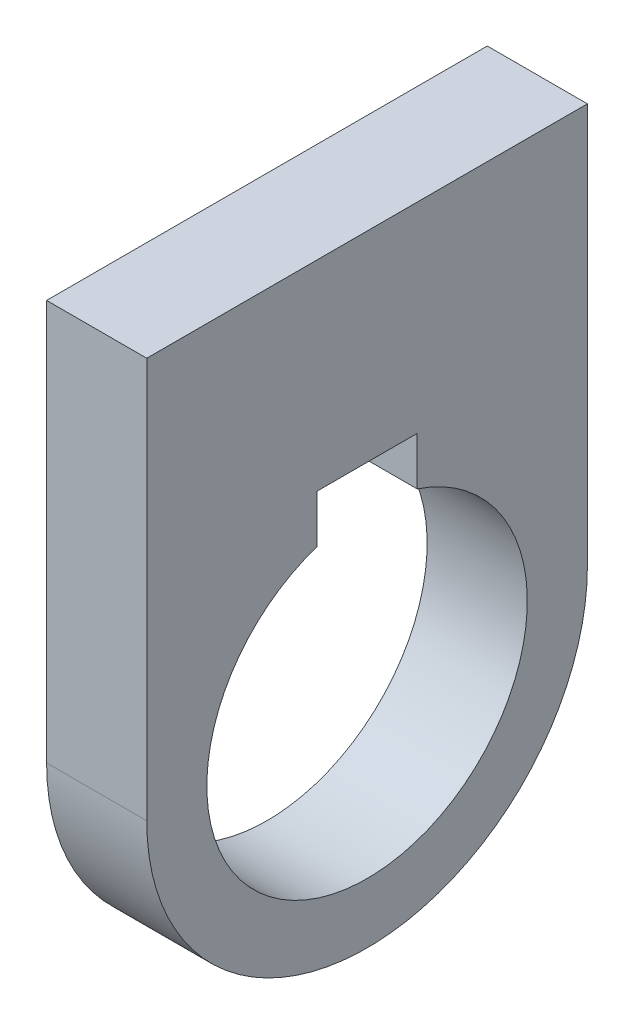
ISO-10303-21;
HEADER;
FILE_DESCRIPTION(('STEP AP214'),'2;1');
FILE_NAME('part.step','',(''),(''),'','','');
FILE_SCHEMA(('AUTOMOTIVE_DESIGN { 1 0 10303 214 1 1 1 1 }'));
ENDSEC;
DATA;
#1=APPLICATION_CONTEXT('core data for automotive mechanical design processes');
#2=APPLICATION_PROTOCOL_DEFINITION('international standard','automotive_design',2000,#1);
#3=PRODUCT_CONTEXT('',#1,'mechanical');
#4=PRODUCT('Part','Part','',(#3));
#5=PRODUCT_RELATED_PRODUCT_CATEGORY('part','',(#4));
#6=PRODUCT_DEFINITION_FORMATION('','',#4);
#7=PRODUCT_DEFINITION_CONTEXT('part definition',#1,'design');
#8=PRODUCT_DEFINITION('design','',#6,#7);
#9=PRODUCT_DEFINITION_SHAPE('','',#8);
#10=(LENGTH_UNIT() NAMED_UNIT(*) SI_UNIT(.MILLI.,.METRE.));
#11=(NAMED_UNIT(*) PLANE_ANGLE_UNIT() SI_UNIT($,.RADIAN.));
#12=(NAMED_UNIT(*) SI_UNIT($,.STERADIAN.) SOLID_ANGLE_UNIT());
#13=UNCERTAINTY_MEASURE_WITH_UNIT(LENGTH_MEASURE(1.E-05),#10,'distance_accuracy_value','');
#14=(GEOMETRIC_REPRESENTATION_CONTEXT(3) GLOBAL_UNCERTAINTY_ASSIGNED_CONTEXT((#13)) GLOBAL_UNIT_ASSIGNED_CONTEXT((#10,
#11,#12)) REPRESENTATION_CONTEXT('',''));
#15=CARTESIAN_POINT('',(0.,0.,0.));
#16=DIRECTION('',(0.,0.,1.));
#17=DIRECTION('',(1.,0.,0.));
#18=AXIS2_PLACEMENT_3D('',#15,#16,#17);
#19=CARTESIAN_POINT('',(5.,0.,0.));
#20=DIRECTION('',(1.,0.,0.));
#21=DIRECTION('',(0.,0.,-1.));
#22=AXIS2_PLACEMENT_3D('',#19,#20,#21);
#23=PLANE('',#22);
#24=CARTESIAN_POINT('',(5.,0.,0.));
#25=DIRECTION('',(1.,0.,0.));
#26=DIRECTION('',(0.,0.,-1.));
#27=AXIS2_PLACEMENT_3D('',#24,#25,#26);
#28=CIRCLE('',#27,11.);
#29=CARTESIAN_POINT('',(5.,0.,11.));
#30=VERTEX_POINT('',#29);
#31=CARTESIAN_POINT('',(5.,0.,-11.));
#32=VERTEX_POINT('',#31);
#33=EDGE_CURVE('E138',#30,#32,#28,.T.);
#34=ORIENTED_EDGE('',*,*,#33,.T.);
#35=DIRECTION('',(0.,1.,0.));
#36=VECTOR('',#35,1.);
#37=CARTESIAN_POINT('',(5.,20.,-11.));
#38=LINE('',#37,#36);
#39=CARTESIAN_POINT('',(5.,20.,-11.));
#40=VERTEX_POINT('',#39);
#41=EDGE_CURVE('E141',#32,#40,#38,.T.);
#42=ORIENTED_EDGE('',*,*,#41,.T.);
#43=DIRECTION('',(0.,0.,1.));
#44=VECTOR('',#43,1.);
#45=CARTESIAN_POINT('',(5.,20.,11.));
#46=LINE('',#45,#44);
#47=CARTESIAN_POINT('',(5.,20.,11.));
#48=VERTEX_POINT('',#47);
#49=EDGE_CURVE('E144',#40,#48,#46,.T.);
#50=ORIENTED_EDGE('',*,*,#49,.T.);
#51=DIRECTION('',(0.,-1.,0.));
#52=VECTOR('',#51,1.);
#53=CARTESIAN_POINT('',(5.,0.,11.));
#54=LINE('',#53,#52);
#55=EDGE_CURVE('E146',#48,#30,#54,.T.);
#56=ORIENTED_EDGE('',*,*,#55,.T.);
#57=EDGE_LOOP('',(#34,#42,#50,#56));
#58=FACE_BOUND('',#57,.T.);
#59=CARTESIAN_POINT('',(5.,0.,0.));
#60=DIRECTION('',(1.,0.,0.));
#61=DIRECTION('',(0.,0.,-1.));
#62=AXIS2_PLACEMENT_3D('',#59,#60,#61);
#63=CIRCLE('',#62,8.);
#64=CARTESIAN_POINT('',(5.,7.59934207678533,2.5));
#65=VERTEX_POINT('',#64);
#66=CARTESIAN_POINT('',(5.,7.59934207678533,-2.5));
#67=VERTEX_POINT('',#66);
#68=EDGE_CURVE('E110',#65,#67,#63,.T.);
#69=ORIENTED_EDGE('',*,*,#68,.F.);
#70=DIRECTION('',(0.,-1.,0.));
#71=VECTOR('',#70,1.);
#72=CARTESIAN_POINT('',(5.,10.,2.5));
#73=LINE('',#72,#71);
#74=CARTESIAN_POINT('',(5.,10.,2.5));
#75=VERTEX_POINT('',#74);
#76=EDGE_CURVE('E102',#75,#65,#73,.T.);
#77=ORIENTED_EDGE('',*,*,#76,.F.);
#78=DIRECTION('',(0.,0.,1.));
#79=VECTOR('',#78,1.);
#80=CARTESIAN_POINT('',(5.,10.,2.5));
#81=LINE('',#80,#79);
#82=CARTESIAN_POINT('',(5.,10.,-2.5));
#83=VERTEX_POINT('',#82);
#84=EDGE_CURVE('E124',#83,#75,#81,.T.);
#85=ORIENTED_EDGE('',*,*,#84,.F.);
#86=DIRECTION('',(0.,1.,0.));
#87=VECTOR('',#86,1.);
#88=CARTESIAN_POINT('',(5.,10.,-2.5));
#89=LINE('',#88,#87);
#90=EDGE_CURVE('E122',#67,#83,#89,.T.);
#91=ORIENTED_EDGE('',*,*,#90,.F.);
#92=EDGE_LOOP('',(#69,#77,#85,#91));
#93=FACE_BOUND('',#92,.T.);
#94=ADVANCED_FACE('F37',(#58,#93),#23,.T.);
#95=CARTESIAN_POINT('',(0.,0.,0.));
#96=DIRECTION('',(1.,0.,0.));
#97=DIRECTION('',(0.,0.,-1.));
#98=AXIS2_PLACEMENT_3D('',#95,#96,#97);
#99=PLANE('',#98);
#100=CARTESIAN_POINT('',(0.,0.,0.));
#101=DIRECTION('',(1.,0.,0.));
#102=DIRECTION('',(0.,0.,-1.));
#103=AXIS2_PLACEMENT_3D('',#100,#101,#102);
#104=CIRCLE('',#103,11.);
#105=CARTESIAN_POINT('',(0.,0.,11.));
#106=VERTEX_POINT('',#105);
#107=CARTESIAN_POINT('',(0.,0.,-11.));
#108=VERTEX_POINT('',#107);
#109=EDGE_CURVE('E118',#106,#108,#104,.T.);
#110=ORIENTED_EDGE('',*,*,#109,.F.);
#111=DIRECTION('',(0.,-1.,0.));
#112=VECTOR('',#111,1.);
#113=CARTESIAN_POINT('',(0.,0.,11.));
#114=LINE('',#113,#112);
#115=CARTESIAN_POINT('',(0.,20.,11.));
#116=VERTEX_POINT('',#115);
#117=EDGE_CURVE('E142',#116,#106,#114,.T.);
#118=ORIENTED_EDGE('',*,*,#117,.F.);
#119=DIRECTION('',(0.,0.,1.));
#120=VECTOR('',#119,1.);
#121=CARTESIAN_POINT('',(0.,20.,11.));
#122=LINE('',#121,#120);
#123=CARTESIAN_POINT('',(0.,20.,-11.));
#124=VERTEX_POINT('',#123);
#125=EDGE_CURVE('E153',#124,#116,#122,.T.);
#126=ORIENTED_EDGE('',*,*,#125,.F.);
#127=DIRECTION('',(0.,1.,0.));
#128=VECTOR('',#127,1.);
#129=CARTESIAN_POINT('',(0.,20.,-11.));
#130=LINE('',#129,#128);
#131=EDGE_CURVE('E151',#108,#124,#130,.T.);
#132=ORIENTED_EDGE('',*,*,#131,.F.);
#133=EDGE_LOOP('',(#110,#118,#126,#132));
#134=FACE_BOUND('',#133,.T.);
#135=DIRECTION('',(0.,-1.,0.));
#136=VECTOR('',#135,1.);
#137=CARTESIAN_POINT('',(0.,10.,2.5));
#138=LINE('',#137,#136);
#139=CARTESIAN_POINT('',(0.,10.,2.5));
#140=VERTEX_POINT('',#139);
#141=CARTESIAN_POINT('',(0.,7.59934207678533,2.5));
#142=VERTEX_POINT('',#141);
#143=EDGE_CURVE('E60',#140,#142,#138,.T.);
#144=ORIENTED_EDGE('',*,*,#143,.T.);
#145=CARTESIAN_POINT('',(0.,0.,0.));
#146=DIRECTION('',(1.,0.,0.));
#147=DIRECTION('',(0.,0.,-1.));
#148=AXIS2_PLACEMENT_3D('',#145,#146,#147);
#149=CIRCLE('',#148,8.);
#150=CARTESIAN_POINT('',(0.,7.59934207678533,-2.5));
#151=VERTEX_POINT('',#150);
#152=EDGE_CURVE('E117',#142,#151,#149,.T.);
#153=ORIENTED_EDGE('',*,*,#152,.T.);
#154=DIRECTION('',(0.,1.,0.));
#155=VECTOR('',#154,1.);
#156=CARTESIAN_POINT('',(0.,10.,-2.5));
#157=LINE('',#156,#155);
#158=CARTESIAN_POINT('',(0.,10.,-2.5));
#159=VERTEX_POINT('',#158);
#160=EDGE_CURVE('E130',#151,#159,#157,.T.);
#161=ORIENTED_EDGE('',*,*,#160,.T.);
#162=DIRECTION('',(0.,0.,1.));
#163=VECTOR('',#162,1.);
#164=CARTESIAN_POINT('',(0.,10.,2.5));
#165=LINE('',#164,#163);
#166=EDGE_CURVE('E111',#159,#140,#165,.T.);
#167=ORIENTED_EDGE('',*,*,#166,.T.);
#168=EDGE_LOOP('',(#144,#153,#161,#167));
#169=FACE_BOUND('',#168,.T.);
#170=ADVANCED_FACE('F171',(#134,#169),#99,.F.);
#171=CARTESIAN_POINT('',(5.,0.,0.));
#172=DIRECTION('',(-1.,0.,0.));
#173=DIRECTION('',(0.,0.,1.));
#174=AXIS2_PLACEMENT_3D('',#171,#172,#173);
#175=CYLINDRICAL_SURFACE('',#174,11.);
#176=ORIENTED_EDGE('',*,*,#109,.T.);
#177=DIRECTION('',(-1.,0.,0.));
#178=VECTOR('',#177,1.);
#179=CARTESIAN_POINT('',(5.,0.,-11.));
#180=LINE('',#179,#178);
#181=EDGE_CURVE('E11',#32,#108,#180,.T.);
#182=ORIENTED_EDGE('',*,*,#181,.F.);
#183=ORIENTED_EDGE('',*,*,#33,.F.);
#184=DIRECTION('',(-1.,0.,0.));
#185=VECTOR('',#184,1.);
#186=CARTESIAN_POINT('',(5.,0.,11.));
#187=LINE('',#186,#185);
#188=EDGE_CURVE('E148',#30,#106,#187,.T.);
#189=ORIENTED_EDGE('',*,*,#188,.T.);
#190=EDGE_LOOP('',(#176,#182,#183,#189));
#191=FACE_BOUND('',#190,.T.);
#192=ADVANCED_FACE('F39',(#191),#175,.T.);
#193=CARTESIAN_POINT('',(5.,20.,-11.));
#194=DIRECTION('',(0.,0.,1.));
#195=DIRECTION('',(0.,-1.,0.));
#196=AXIS2_PLACEMENT_3D('',#193,#194,#195);
#197=PLANE('',#196);
#198=ORIENTED_EDGE('',*,*,#131,.T.);
#199=DIRECTION('',(-1.,0.,0.));
#200=VECTOR('',#199,1.);
#201=CARTESIAN_POINT('',(5.,20.,-11.));
#202=LINE('',#201,#200);
#203=EDGE_CURVE('E45',#40,#124,#202,.T.);
#204=ORIENTED_EDGE('',*,*,#203,.F.);
#205=ORIENTED_EDGE('',*,*,#41,.F.);
#206=ORIENTED_EDGE('',*,*,#181,.T.);
#207=EDGE_LOOP('',(#198,#204,#205,#206));
#208=FACE_BOUND('',#207,.T.);
#209=ADVANCED_FACE('F181',(#208),#197,.F.);
#210=CARTESIAN_POINT('',(5.,20.,11.));
#211=DIRECTION('',(0.,-1.,0.));
#212=DIRECTION('',(0.,0.,-1.));
#213=AXIS2_PLACEMENT_3D('',#210,#211,#212);
#214=PLANE('',#213);
#215=ORIENTED_EDGE('',*,*,#125,.T.);
#216=DIRECTION('',(-1.,0.,0.));
#217=VECTOR('',#216,1.);
#218=CARTESIAN_POINT('',(5.,20.,11.));
#219=LINE('',#218,#217);
#220=EDGE_CURVE('E158',#48,#116,#219,.T.);
#221=ORIENTED_EDGE('',*,*,#220,.F.);
#222=ORIENTED_EDGE('',*,*,#49,.F.);
#223=ORIENTED_EDGE('',*,*,#203,.T.);
#224=EDGE_LOOP('',(#215,#221,#222,#223));
#225=FACE_BOUND('',#224,.T.);
#226=ADVANCED_FACE('F165',(#225),#214,.F.);
#227=CARTESIAN_POINT('',(5.,0.,11.));
#228=DIRECTION('',(0.,0.,-1.));
#229=DIRECTION('',(0.,1.,0.));
#230=AXIS2_PLACEMENT_3D('',#227,#228,#229);
#231=PLANE('',#230);
#232=ORIENTED_EDGE('',*,*,#117,.T.);
#233=ORIENTED_EDGE('',*,*,#188,.F.);
#234=ORIENTED_EDGE('',*,*,#55,.F.);
#235=ORIENTED_EDGE('',*,*,#220,.T.);
#236=EDGE_LOOP('',(#232,#233,#234,#235));
#237=FACE_BOUND('',#236,.T.);
#238=ADVANCED_FACE('F175',(#237),#231,.F.);
#239=CARTESIAN_POINT('',(5.,10.,2.5));
#240=DIRECTION('',(0.,0.,-1.));
#241=DIRECTION('',(0.,1.,0.));
#242=AXIS2_PLACEMENT_3D('',#239,#240,#241);
#243=PLANE('',#242);
#244=ORIENTED_EDGE('',*,*,#143,.F.);
#245=DIRECTION('',(-1.,0.,0.));
#246=VECTOR('',#245,1.);
#247=CARTESIAN_POINT('',(5.,10.,2.5));
#248=LINE('',#247,#246);
#249=EDGE_CURVE('E106',#75,#140,#248,.T.);
#250=ORIENTED_EDGE('',*,*,#249,.F.);
#251=ORIENTED_EDGE('',*,*,#76,.T.);
#252=DIRECTION('',(-1.,0.,0.));
#253=VECTOR('',#252,1.);
#254=CARTESIAN_POINT('',(5.,7.59934207678533,2.5));
#255=LINE('',#254,#253);
#256=EDGE_CURVE('E105',#65,#142,#255,.T.);
#257=ORIENTED_EDGE('',*,*,#256,.T.);
#258=EDGE_LOOP('',(#244,#250,#251,#257));
#259=FACE_BOUND('',#258,.T.);
#260=ADVANCED_FACE('F104',(#259),#243,.T.);
#261=CARTESIAN_POINT('',(5.,0.,0.));
#262=DIRECTION('',(-1.,0.,0.));
#263=DIRECTION('',(0.,0.,1.));
#264=AXIS2_PLACEMENT_3D('',#261,#262,#263);
#265=CYLINDRICAL_SURFACE('',#264,8.);
#266=ORIENTED_EDGE('',*,*,#152,.F.);
#267=ORIENTED_EDGE('',*,*,#256,.F.);
#268=ORIENTED_EDGE('',*,*,#68,.T.);
#269=DIRECTION('',(-1.,0.,0.));
#270=VECTOR('',#269,1.);
#271=CARTESIAN_POINT('',(5.,7.59934207678533,-2.5));
#272=LINE('',#271,#270);
#273=EDGE_CURVE('E119',#67,#151,#272,.T.);
#274=ORIENTED_EDGE('',*,*,#273,.T.);
#275=EDGE_LOOP('',(#266,#267,#268,#274));
#276=FACE_BOUND('',#275,.T.);
#277=ADVANCED_FACE('F114',(#276),#265,.F.);
#278=CARTESIAN_POINT('',(5.,10.,-2.5));
#279=DIRECTION('',(0.,0.,1.));
#280=DIRECTION('',(0.,-1.,0.));
#281=AXIS2_PLACEMENT_3D('',#278,#279,#280);
#282=PLANE('',#281);
#283=ORIENTED_EDGE('',*,*,#160,.F.);
#284=ORIENTED_EDGE('',*,*,#273,.F.);
#285=ORIENTED_EDGE('',*,*,#90,.T.);
#286=DIRECTION('',(-1.,0.,0.));
#287=VECTOR('',#286,1.);
#288=CARTESIAN_POINT('',(5.,10.,-2.5));
#289=LINE('',#288,#287);
#290=EDGE_CURVE('E52',#83,#159,#289,.T.);
#291=ORIENTED_EDGE('',*,*,#290,.T.);
#292=EDGE_LOOP('',(#283,#284,#285,#291));
#293=FACE_BOUND('',#292,.T.);
#294=ADVANCED_FACE('F204',(#293),#282,.T.);
#295=CARTESIAN_POINT('',(5.,10.,2.5));
#296=DIRECTION('',(0.,-1.,0.));
#297=DIRECTION('',(0.,0.,-1.));
#298=AXIS2_PLACEMENT_3D('',#295,#296,#297);
#299=PLANE('',#298);
#300=ORIENTED_EDGE('',*,*,#166,.F.);
#301=ORIENTED_EDGE('',*,*,#290,.F.);
#302=ORIENTED_EDGE('',*,*,#84,.T.);
#303=ORIENTED_EDGE('',*,*,#249,.T.);
#304=EDGE_LOOP('',(#300,#301,#302,#303));
#305=FACE_BOUND('',#304,.T.);
#306=ADVANCED_FACE('F208',(#305),#299,.T.);
#307=CLOSED_SHELL('',(#94,#170,#192,#209,#226,#238,#260,#277,#294,#306));
#308=MANIFOLD_SOLID_BREP('B2',#307);
#309=ADVANCED_BREP_SHAPE_REPRESENTATION('',(#18,#308),#14);
#310=SHAPE_DEFINITION_REPRESENTATION(#9,#309);
ENDSEC;
END-ISO-10303-21;
